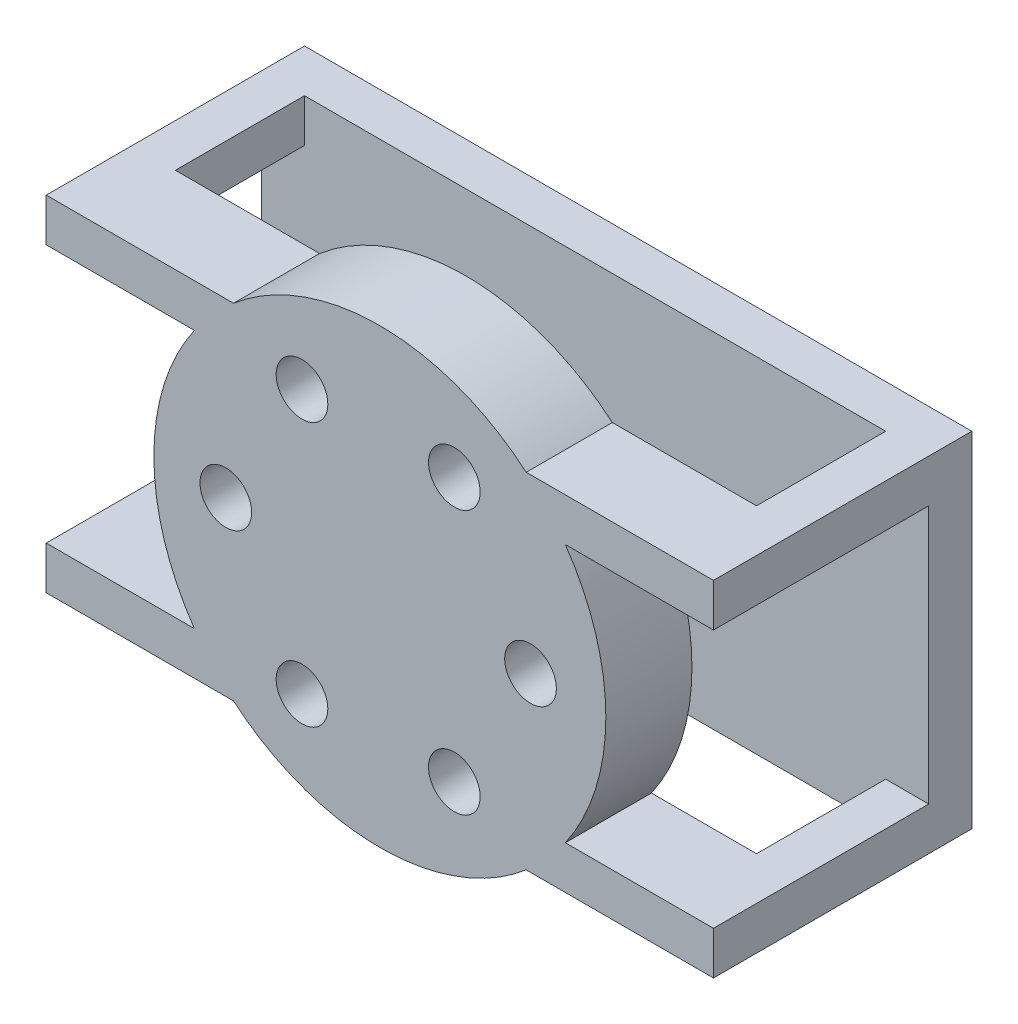
ISO-10303-21;
HEADER;
FILE_DESCRIPTION(('STEP AP214'),'2;1');
FILE_NAME('part.step','',(''),(''),'','','');
FILE_SCHEMA(('AUTOMOTIVE_DESIGN { 1 0 10303 214 1 1 1 1 }'));
ENDSEC;
DATA;
#1=APPLICATION_CONTEXT('core data for automotive mechanical design processes');
#2=APPLICATION_PROTOCOL_DEFINITION('international standard','automotive_design',2000,#1);
#3=PRODUCT_CONTEXT('',#1,'mechanical');
#4=PRODUCT('Part','Part','',(#3));
#5=PRODUCT_RELATED_PRODUCT_CATEGORY('part','',(#4));
#6=PRODUCT_DEFINITION_FORMATION('','',#4);
#7=PRODUCT_DEFINITION_CONTEXT('part definition',#1,'design');
#8=PRODUCT_DEFINITION('design','',#6,#7);
#9=PRODUCT_DEFINITION_SHAPE('','',#8);
#10=(LENGTH_UNIT() NAMED_UNIT(*) SI_UNIT(.MILLI.,.METRE.));
#11=(NAMED_UNIT(*) PLANE_ANGLE_UNIT() SI_UNIT($,.RADIAN.));
#12=(NAMED_UNIT(*) SI_UNIT($,.STERADIAN.) SOLID_ANGLE_UNIT());
#13=UNCERTAINTY_MEASURE_WITH_UNIT(LENGTH_MEASURE(1.E-05),#10,'distance_accuracy_value','');
#14=(GEOMETRIC_REPRESENTATION_CONTEXT(3) GLOBAL_UNCERTAINTY_ASSIGNED_CONTEXT((#13)) GLOBAL_UNIT_ASSIGNED_CONTEXT((#10,
#11,#12)) REPRESENTATION_CONTEXT('',''));
#15=CARTESIAN_POINT('',(0.,0.,0.));
#16=DIRECTION('',(0.,0.,1.));
#17=DIRECTION('',(1.,0.,0.));
#18=AXIS2_PLACEMENT_3D('',#15,#16,#17);
#19=CARTESIAN_POINT('',(-77.5,-30.,0.));
#20=DIRECTION('',(0.,1.,0.));
#21=DIRECTION('',(0.,0.,1.));
#22=AXIS2_PLACEMENT_3D('',#19,#20,#21);
#23=PLANE('',#22);
#24=DIRECTION('',(0.,0.,1.));
#25=VECTOR('',#24,1.);
#26=CARTESIAN_POINT('',(-67.5,-30.,0.));
#27=LINE('',#26,#25);
#28=CARTESIAN_POINT('',(-67.5,-30.,-50.));
#29=VERTEX_POINT('',#28);
#30=CARTESIAN_POINT('',(-67.5,-30.,-20.));
#31=VERTEX_POINT('',#30);
#32=EDGE_CURVE('E274',#29,#31,#27,.T.);
#33=ORIENTED_EDGE('',*,*,#32,.F.);
#34=DIRECTION('',(1.,0.,0.));
#35=VECTOR('',#34,1.);
#36=CARTESIAN_POINT('',(-77.5,-30.,-50.));
#37=LINE('',#36,#35);
#38=CARTESIAN_POINT('',(-77.5,-30.,-50.));
#39=VERTEX_POINT('',#38);
#40=EDGE_CURVE('E396',#39,#29,#37,.T.);
#41=ORIENTED_EDGE('',*,*,#40,.F.);
#42=DIRECTION('',(0.,0.,1.));
#43=VECTOR('',#42,1.);
#44=CARTESIAN_POINT('',(-77.5,-30.,0.));
#45=LINE('',#44,#43);
#46=CARTESIAN_POINT('',(-77.5,-30.,0.));
#47=VERTEX_POINT('',#46);
#48=EDGE_CURVE('E357',#39,#47,#45,.T.);
#49=ORIENTED_EDGE('',*,*,#48,.T.);
#50=DIRECTION('',(1.,0.,0.));
#51=VECTOR('',#50,1.);
#52=CARTESIAN_POINT('',(-77.5,-30.,0.));
#53=LINE('',#52,#51);
#54=CARTESIAN_POINT('',(-43.0842198490352,-30.,0.));
#55=VERTEX_POINT('',#54);
#56=EDGE_CURVE('E392',#47,#55,#53,.T.);
#57=ORIENTED_EDGE('',*,*,#56,.T.);
#58=DIRECTION('',(0.,0.,1.));
#59=VECTOR('',#58,1.);
#60=CARTESIAN_POINT('',(-43.0842198490352,-30.,-20.));
#61=LINE('',#60,#59);
#62=CARTESIAN_POINT('',(-43.0842198490352,-30.,-20.));
#63=VERTEX_POINT('',#62);
#64=EDGE_CURVE('E295',#63,#55,#61,.T.);
#65=ORIENTED_EDGE('',*,*,#64,.F.);
#66=DIRECTION('',(1.,0.,0.));
#67=VECTOR('',#66,1.);
#68=CARTESIAN_POINT('',(-77.5,-30.,-20.));
#69=LINE('',#68,#67);
#70=EDGE_CURVE('E262',#31,#63,#69,.T.);
#71=ORIENTED_EDGE('',*,*,#70,.F.);
#72=EDGE_LOOP('',(#33,#41,#49,#57,#65,#71));
#73=FACE_BOUND('',#72,.T.);
#74=ADVANCED_FACE('F45',(#73),#23,.T.);
#75=CARTESIAN_POINT('',(-77.5,30.,-50.));
#76=DIRECTION('',(0.,-1.,0.));
#77=DIRECTION('',(0.,0.,-1.));
#78=AXIS2_PLACEMENT_3D('',#75,#76,#77);
#79=PLANE('',#78);
#80=DIRECTION('',(0.,0.,1.));
#81=VECTOR('',#80,1.);
#82=CARTESIAN_POINT('',(67.5,30.,-50.));
#83=LINE('',#82,#81);
#84=CARTESIAN_POINT('',(67.5,30.,-50.));
#85=VERTEX_POINT('',#84);
#86=CARTESIAN_POINT('',(67.5,30.,-20.));
#87=VERTEX_POINT('',#86);
#88=EDGE_CURVE('E11',#85,#87,#83,.T.);
#89=ORIENTED_EDGE('',*,*,#88,.F.);
#90=DIRECTION('',(1.,0.,0.));
#91=VECTOR('',#90,1.);
#92=CARTESIAN_POINT('',(-77.5,30.,-50.));
#93=LINE('',#92,#91);
#94=CARTESIAN_POINT('',(77.5,30.,-50.));
#95=VERTEX_POINT('',#94);
#96=EDGE_CURVE('E405',#85,#95,#93,.T.);
#97=ORIENTED_EDGE('',*,*,#96,.T.);
#98=DIRECTION('',(0.,0.,-1.));
#99=VECTOR('',#98,1.);
#100=CARTESIAN_POINT('',(77.5,30.,-50.));
#101=LINE('',#100,#99);
#102=CARTESIAN_POINT('',(77.5,30.,0.));
#103=VERTEX_POINT('',#102);
#104=EDGE_CURVE('E317',#103,#95,#101,.T.);
#105=ORIENTED_EDGE('',*,*,#104,.F.);
#106=DIRECTION('',(1.,0.,0.));
#107=VECTOR('',#106,1.);
#108=CARTESIAN_POINT('',(-77.5,30.,0.));
#109=LINE('',#108,#107);
#110=CARTESIAN_POINT('',(43.0842198490352,30.,0.));
#111=VERTEX_POINT('',#110);
#112=EDGE_CURVE('E376',#111,#103,#109,.T.);
#113=ORIENTED_EDGE('',*,*,#112,.F.);
#114=DIRECTION('',(0.,0.,1.));
#115=VECTOR('',#114,1.);
#116=CARTESIAN_POINT('',(43.0842198490352,30.,-20.));
#117=LINE('',#116,#115);
#118=CARTESIAN_POINT('',(43.0842198490352,30.,-20.));
#119=VERTEX_POINT('',#118);
#120=EDGE_CURVE('E413',#119,#111,#117,.T.);
#121=ORIENTED_EDGE('',*,*,#120,.F.);
#122=DIRECTION('',(-1.,0.,0.));
#123=VECTOR('',#122,1.);
#124=CARTESIAN_POINT('',(-77.5,30.,-20.));
#125=LINE('',#124,#123);
#126=EDGE_CURVE('E259',#87,#119,#125,.T.);
#127=ORIENTED_EDGE('',*,*,#126,.F.);
#128=EDGE_LOOP('',(#89,#97,#105,#113,#121,#127));
#129=FACE_BOUND('',#128,.T.);
#130=ADVANCED_FACE('F501',(#129),#79,.T.);
#131=CARTESIAN_POINT('',(-77.5,40.,0.));
#132=DIRECTION('',(0.,1.,0.));
#133=DIRECTION('',(0.,0.,1.));
#134=AXIS2_PLACEMENT_3D('',#131,#132,#133);
#135=PLANE('',#134);
#136=DIRECTION('',(1.,0.,0.));
#137=VECTOR('',#136,1.);
#138=CARTESIAN_POINT('',(-67.5,40.,-20.));
#139=LINE('',#138,#137);
#140=CARTESIAN_POINT('',(-67.5,40.,-20.));
#141=VERTEX_POINT('',#140);
#142=CARTESIAN_POINT('',(-34.0036762718386,40.,-20.));
#143=VERTEX_POINT('',#142);
#144=EDGE_CURVE('E61',#141,#143,#139,.T.);
#145=ORIENTED_EDGE('',*,*,#144,.F.);
#146=DIRECTION('',(0.,0.,1.));
#147=VECTOR('',#146,1.);
#148=CARTESIAN_POINT('',(-67.5,40.,-50.));
#149=LINE('',#148,#147);
#150=CARTESIAN_POINT('',(-67.5,40.,-50.));
#151=VERTEX_POINT('',#150);
#152=EDGE_CURVE('E218',#151,#141,#149,.T.);
#153=ORIENTED_EDGE('',*,*,#152,.F.);
#154=DIRECTION('',(-1.,0.,0.));
#155=VECTOR('',#154,1.);
#156=CARTESIAN_POINT('',(-67.5,40.,-50.));
#157=LINE('',#156,#155);
#158=CARTESIAN_POINT('',(67.5,40.,-50.));
#159=VERTEX_POINT('',#158);
#160=EDGE_CURVE('E215',#159,#151,#157,.T.);
#161=ORIENTED_EDGE('',*,*,#160,.F.);
#162=DIRECTION('',(0.,0.,-1.));
#163=VECTOR('',#162,1.);
#164=CARTESIAN_POINT('',(67.5,40.,-50.));
#165=LINE('',#164,#163);
#166=CARTESIAN_POINT('',(67.5,40.,-20.));
#167=VERTEX_POINT('',#166);
#168=EDGE_CURVE('E232',#167,#159,#165,.T.);
#169=ORIENTED_EDGE('',*,*,#168,.F.);
#170=CARTESIAN_POINT('',(34.0036762718386,40.,-20.));
#171=VERTEX_POINT('',#170);
#172=EDGE_CURVE('E225',#171,#167,#139,.T.);
#173=ORIENTED_EDGE('',*,*,#172,.F.);
#174=DIRECTION('',(0.,0.,1.));
#175=VECTOR('',#174,1.);
#176=CARTESIAN_POINT('',(34.0036762718386,40.,-20.));
#177=LINE('',#176,#175);
#178=CARTESIAN_POINT('',(34.0036762718386,40.,0.));
#179=VERTEX_POINT('',#178);
#180=EDGE_CURVE('E307',#179,#171,#177,.F.);
#181=ORIENTED_EDGE('',*,*,#180,.F.);
#182=DIRECTION('',(1.,0.,0.));
#183=VECTOR('',#182,1.);
#184=CARTESIAN_POINT('',(-77.5,40.,0.));
#185=LINE('',#184,#183);
#186=CARTESIAN_POINT('',(77.5,40.,0.));
#187=VERTEX_POINT('',#186);
#188=EDGE_CURVE('E380',#179,#187,#185,.T.);
#189=ORIENTED_EDGE('',*,*,#188,.T.);
#190=DIRECTION('',(0.,0.,1.));
#191=VECTOR('',#190,1.);
#192=CARTESIAN_POINT('',(77.5,40.,0.));
#193=LINE('',#192,#191);
#194=CARTESIAN_POINT('',(77.5,40.,-60.));
#195=VERTEX_POINT('',#194);
#196=EDGE_CURVE('E341',#195,#187,#193,.T.);
#197=ORIENTED_EDGE('',*,*,#196,.F.);
#198=DIRECTION('',(1.,0.,0.));
#199=VECTOR('',#198,1.);
#200=CARTESIAN_POINT('',(-77.5,40.,-60.));
#201=LINE('',#200,#199);
#202=CARTESIAN_POINT('',(-77.5,40.,-60.));
#203=VERTEX_POINT('',#202);
#204=EDGE_CURVE('E381',#203,#195,#201,.T.);
#205=ORIENTED_EDGE('',*,*,#204,.F.);
#206=DIRECTION('',(0.,0.,1.));
#207=VECTOR('',#206,1.);
#208=CARTESIAN_POINT('',(-77.5,40.,0.));
#209=LINE('',#208,#207);
#210=CARTESIAN_POINT('',(-77.5,40.,0.));
#211=VERTEX_POINT('',#210);
#212=EDGE_CURVE('E373',#203,#211,#209,.T.);
#213=ORIENTED_EDGE('',*,*,#212,.T.);
#214=CARTESIAN_POINT('',(-34.0036762718386,40.,0.));
#215=VERTEX_POINT('',#214);
#216=EDGE_CURVE('E68',#211,#215,#185,.T.);
#217=ORIENTED_EDGE('',*,*,#216,.T.);
#218=DIRECTION('',(0.,0.,1.));
#219=VECTOR('',#218,1.);
#220=CARTESIAN_POINT('',(-34.0036762718386,40.,-20.));
#221=LINE('',#220,#219);
#222=EDGE_CURVE('E229',#143,#215,#221,.T.);
#223=ORIENTED_EDGE('',*,*,#222,.F.);
#224=EDGE_LOOP('',(#145,#153,#161,#169,#173,#181,#189,#197,#205,#213,#217,#223));
#225=FACE_BOUND('',#224,.T.);
#226=ADVANCED_FACE('F228',(#225),#135,.T.);
#227=CARTESIAN_POINT('',(-77.5,40.,-60.));
#228=DIRECTION('',(0.,0.,-1.));
#229=DIRECTION('',(-1.,0.,0.));
#230=AXIS2_PLACEMENT_3D('',#227,#228,#229);
#231=PLANE('',#230);
#232=ORIENTED_EDGE('',*,*,#204,.T.);
#233=DIRECTION('',(0.,1.,0.));
#234=VECTOR('',#233,1.);
#235=CARTESIAN_POINT('',(77.5,40.,-60.));
#236=LINE('',#235,#234);
#237=CARTESIAN_POINT('',(77.5,-40.,-60.));
#238=VERTEX_POINT('',#237);
#239=EDGE_CURVE('E337',#238,#195,#236,.T.);
#240=ORIENTED_EDGE('',*,*,#239,.F.);
#241=DIRECTION('',(1.,0.,0.));
#242=VECTOR('',#241,1.);
#243=CARTESIAN_POINT('',(-77.5,-40.,-60.));
#244=LINE('',#243,#242);
#245=CARTESIAN_POINT('',(-77.5,-40.,-60.));
#246=VERTEX_POINT('',#245);
#247=EDGE_CURVE('E384',#246,#238,#244,.T.);
#248=ORIENTED_EDGE('',*,*,#247,.F.);
#249=DIRECTION('',(0.,1.,0.));
#250=VECTOR('',#249,1.);
#251=CARTESIAN_POINT('',(-77.5,40.,-60.));
#252=LINE('',#251,#250);
#253=EDGE_CURVE('E369',#246,#203,#252,.T.);
#254=ORIENTED_EDGE('',*,*,#253,.T.);
#255=EDGE_LOOP('',(#232,#240,#248,#254));
#256=FACE_BOUND('',#255,.T.);
#257=ADVANCED_FACE('F540',(#256),#231,.T.);
#258=CARTESIAN_POINT('',(-77.5,-40.,-60.));
#259=DIRECTION('',(0.,-1.,0.));
#260=DIRECTION('',(0.,0.,-1.));
#261=AXIS2_PLACEMENT_3D('',#258,#259,#260);
#262=PLANE('',#261);
#263=DIRECTION('',(-1.,0.,0.));
#264=VECTOR('',#263,1.);
#265=CARTESIAN_POINT('',(-77.5,-40.,-20.));
#266=LINE('',#265,#264);
#267=CARTESIAN_POINT('',(67.5,-40.,-20.));
#268=VERTEX_POINT('',#267);
#269=CARTESIAN_POINT('',(34.0036762718386,-40.,-20.));
#270=VERTEX_POINT('',#269);
#271=EDGE_CURVE('E258',#268,#270,#266,.T.);
#272=ORIENTED_EDGE('',*,*,#271,.F.);
#273=DIRECTION('',(0.,0.,1.));
#274=VECTOR('',#273,1.);
#275=CARTESIAN_POINT('',(67.5,-40.,-60.));
#276=LINE('',#275,#274);
#277=CARTESIAN_POINT('',(67.5,-40.,-50.));
#278=VERTEX_POINT('',#277);
#279=EDGE_CURVE('E268',#278,#268,#276,.T.);
#280=ORIENTED_EDGE('',*,*,#279,.F.);
#281=DIRECTION('',(1.,0.,0.));
#282=VECTOR('',#281,1.);
#283=CARTESIAN_POINT('',(-77.5,-40.,-50.));
#284=LINE('',#283,#282);
#285=CARTESIAN_POINT('',(-67.5,-40.,-50.));
#286=VERTEX_POINT('',#285);
#287=EDGE_CURVE('E271',#286,#278,#284,.T.);
#288=ORIENTED_EDGE('',*,*,#287,.F.);
#289=DIRECTION('',(0.,0.,-1.));
#290=VECTOR('',#289,1.);
#291=CARTESIAN_POINT('',(-67.5,-40.,-60.));
#292=LINE('',#291,#290);
#293=CARTESIAN_POINT('',(-67.5,-40.,-20.));
#294=VERTEX_POINT('',#293);
#295=EDGE_CURVE('E277',#294,#286,#292,.T.);
#296=ORIENTED_EDGE('',*,*,#295,.F.);
#297=CARTESIAN_POINT('',(-34.0036762718386,-40.,-20.));
#298=VERTEX_POINT('',#297);
#299=EDGE_CURVE('E254',#298,#294,#266,.T.);
#300=ORIENTED_EDGE('',*,*,#299,.F.);
#301=DIRECTION('',(0.,0.,1.));
#302=VECTOR('',#301,1.);
#303=CARTESIAN_POINT('',(-34.0036762718386,-40.,-20.));
#304=LINE('',#303,#302);
#305=CARTESIAN_POINT('',(-34.0036762718386,-40.,0.));
#306=VERTEX_POINT('',#305);
#307=EDGE_CURVE('E299',#306,#298,#304,.F.);
#308=ORIENTED_EDGE('',*,*,#307,.F.);
#309=DIRECTION('',(1.,0.,0.));
#310=VECTOR('',#309,1.);
#311=CARTESIAN_POINT('',(-77.5,-40.,0.));
#312=LINE('',#311,#310);
#313=CARTESIAN_POINT('',(-77.5,-40.,0.));
#314=VERTEX_POINT('',#313);
#315=EDGE_CURVE('E387',#314,#306,#312,.T.);
#316=ORIENTED_EDGE('',*,*,#315,.F.);
#317=DIRECTION('',(0.,0.,-1.));
#318=VECTOR('',#317,1.);
#319=CARTESIAN_POINT('',(-77.5,-40.,-60.));
#320=LINE('',#319,#318);
#321=EDGE_CURVE('E365',#314,#246,#320,.T.);
#322=ORIENTED_EDGE('',*,*,#321,.T.);
#323=ORIENTED_EDGE('',*,*,#247,.T.);
#324=DIRECTION('',(0.,0.,-1.));
#325=VECTOR('',#324,1.);
#326=CARTESIAN_POINT('',(77.5,-40.,-60.));
#327=LINE('',#326,#325);
#328=CARTESIAN_POINT('',(77.5,-40.,0.));
#329=VERTEX_POINT('',#328);
#330=EDGE_CURVE('E333',#329,#238,#327,.T.);
#331=ORIENTED_EDGE('',*,*,#330,.F.);
#332=CARTESIAN_POINT('',(34.0036762718386,-40.,0.));
#333=VERTEX_POINT('',#332);
#334=EDGE_CURVE('E391',#333,#329,#312,.T.);
#335=ORIENTED_EDGE('',*,*,#334,.F.);
#336=DIRECTION('',(0.,0.,1.));
#337=VECTOR('',#336,1.);
#338=CARTESIAN_POINT('',(34.0036762718386,-40.,-20.));
#339=LINE('',#338,#337);
#340=EDGE_CURVE('E303',#270,#333,#339,.T.);
#341=ORIENTED_EDGE('',*,*,#340,.F.);
#342=EDGE_LOOP('',(#272,#280,#288,#296,#300,#308,#316,#322,#323,#331,#335,#341));
#343=FACE_BOUND('',#342,.T.);
#344=ADVANCED_FACE('F451',(#343),#262,.T.);
#345=CARTESIAN_POINT('',(-77.5,-40.,0.));
#346=DIRECTION('',(0.,0.,1.));
#347=DIRECTION('',(1.,0.,0.));
#348=AXIS2_PLACEMENT_3D('',#345,#346,#347);
#349=PLANE('',#348);
#350=CARTESIAN_POINT('',(17.3038145922156,-30.650692226442,0.));
#351=DIRECTION('',(0.,0.,1.));
#352=DIRECTION('',(1.,0.,0.));
#353=AXIS2_PLACEMENT_3D('',#350,#351,#352);
#354=CIRCLE('',#353,6.00000000000001);
#355=CARTESIAN_POINT('',(23.3038145922156,-30.650692226442,0.));
#356=VERTEX_POINT('',#355);
#357=EDGE_CURVE('E781',#356,#356,#354,.T.);
#358=ORIENTED_EDGE('',*,*,#357,.F.);
#359=EDGE_LOOP('',(#358));
#360=FACE_BOUND('',#359,.T.);
#361=CARTESIAN_POINT('',(-18.0885562233539,-30.6506922264423,0.));
#362=DIRECTION('',(0.,0.,1.));
#363=DIRECTION('',(1.,0.,0.));
#364=AXIS2_PLACEMENT_3D('',#361,#362,#363);
#365=CIRCLE('',#364,6.00000000000001);
#366=CARTESIAN_POINT('',(-12.0885562233539,-30.6506922264423,0.));
#367=VERTEX_POINT('',#366);
#368=EDGE_CURVE('E775',#367,#367,#365,.T.);
#369=ORIENTED_EDGE('',*,*,#368,.F.);
#370=EDGE_LOOP('',(#369));
#371=FACE_BOUND('',#370,.T.);
#372=CARTESIAN_POINT('',(-35.784741631139,0.,0.));
#373=DIRECTION('',(0.,0.,1.));
#374=DIRECTION('',(1.,0.,0.));
#375=AXIS2_PLACEMENT_3D('',#372,#373,#374);
#376=CIRCLE('',#375,6.00000000000001);
#377=CARTESIAN_POINT('',(-29.784741631139,0.,0.));
#378=VERTEX_POINT('',#377);
#379=EDGE_CURVE('E769',#378,#378,#376,.T.);
#380=ORIENTED_EDGE('',*,*,#379,.F.);
#381=EDGE_LOOP('',(#380));
#382=FACE_BOUND('',#381,.T.);
#383=CARTESIAN_POINT('',(-18.0885562233544,30.6506922264421,0.));
#384=DIRECTION('',(0.,0.,1.));
#385=DIRECTION('',(1.,0.,0.));
#386=AXIS2_PLACEMENT_3D('',#383,#384,#385);
#387=CIRCLE('',#386,6.00000000000001);
#388=CARTESIAN_POINT('',(-12.0885562233544,30.6506922264421,0.));
#389=VERTEX_POINT('',#388);
#390=EDGE_CURVE('E763',#389,#389,#387,.T.);
#391=ORIENTED_EDGE('',*,*,#390,.F.);
#392=EDGE_LOOP('',(#391));
#393=FACE_BOUND('',#392,.T.);
#394=CARTESIAN_POINT('',(17.3038145922152,30.6506922264422,0.));
#395=DIRECTION('',(0.,0.,1.));
#396=DIRECTION('',(1.,0.,0.));
#397=AXIS2_PLACEMENT_3D('',#394,#395,#396);
#398=CIRCLE('',#397,6.00000000000001);
#399=CARTESIAN_POINT('',(23.3038145922152,30.6506922264422,0.));
#400=VERTEX_POINT('',#399);
#401=EDGE_CURVE('E757',#400,#400,#398,.T.);
#402=ORIENTED_EDGE('',*,*,#401,.F.);
#403=EDGE_LOOP('',(#402));
#404=FACE_BOUND('',#403,.T.);
#405=CARTESIAN_POINT('',(35.,0.,0.));
#406=DIRECTION('',(0.,0.,1.));
#407=DIRECTION('',(1.,0.,0.));
#408=AXIS2_PLACEMENT_3D('',#405,#406,#407);
#409=CIRCLE('',#408,6.00000000000001);
#410=CARTESIAN_POINT('',(41.,0.,0.));
#411=VERTEX_POINT('',#410);
#412=EDGE_CURVE('E750',#411,#411,#409,.T.);
#413=ORIENTED_EDGE('',*,*,#412,.F.);
#414=EDGE_LOOP('',(#413));
#415=FACE_BOUND('',#414,.T.);
#416=CARTESIAN_POINT('',(43.0842198490352,-30.,0.));
#417=VERTEX_POINT('',#416);
#418=CARTESIAN_POINT('',(77.5,-30.,0.));
#419=VERTEX_POINT('',#418);
#420=EDGE_CURVE('E395',#417,#419,#53,.T.);
#421=ORIENTED_EDGE('',*,*,#420,.F.);
#422=CARTESIAN_POINT('',(0.,0.,0.));
#423=DIRECTION('',(0.,0.,1.));
#424=DIRECTION('',(1.,0.,0.));
#425=AXIS2_PLACEMENT_3D('',#422,#423,#424);
#426=CIRCLE('',#425,52.5);
#427=EDGE_CURVE('E280',#417,#111,#426,.T.);
#428=ORIENTED_EDGE('',*,*,#427,.T.);
#429=ORIENTED_EDGE('',*,*,#112,.T.);
#430=DIRECTION('',(0.,-1.,0.));
#431=VECTOR('',#430,1.);
#432=CARTESIAN_POINT('',(77.5,30.,0.));
#433=LINE('',#432,#431);
#434=EDGE_CURVE('E313',#187,#103,#433,.T.);
#435=ORIENTED_EDGE('',*,*,#434,.F.);
#436=ORIENTED_EDGE('',*,*,#188,.F.);
#437=EDGE_CURVE('E286',#179,#215,#426,.T.);
#438=ORIENTED_EDGE('',*,*,#437,.T.);
#439=ORIENTED_EDGE('',*,*,#216,.F.);
#440=DIRECTION('',(0.,-1.,0.));
#441=VECTOR('',#440,1.);
#442=CARTESIAN_POINT('',(-77.5,30.,0.));
#443=LINE('',#442,#441);
#444=CARTESIAN_POINT('',(-77.5,30.,0.));
#445=VERTEX_POINT('',#444);
#446=EDGE_CURVE('E345',#211,#445,#443,.T.);
#447=ORIENTED_EDGE('',*,*,#446,.T.);
#448=CARTESIAN_POINT('',(-43.0842198490352,30.,0.));
#449=VERTEX_POINT('',#448);
#450=EDGE_CURVE('E406',#445,#449,#109,.T.);
#451=ORIENTED_EDGE('',*,*,#450,.T.);
#452=EDGE_CURVE('E438',#449,#55,#426,.T.);
#453=ORIENTED_EDGE('',*,*,#452,.T.);
#454=ORIENTED_EDGE('',*,*,#56,.F.);
#455=DIRECTION('',(0.,-1.,0.));
#456=VECTOR('',#455,1.);
#457=CARTESIAN_POINT('',(-77.5,-40.,0.));
#458=LINE('',#457,#456);
#459=EDGE_CURVE('E361',#47,#314,#458,.T.);
#460=ORIENTED_EDGE('',*,*,#459,.T.);
#461=ORIENTED_EDGE('',*,*,#315,.T.);
#462=EDGE_CURVE('E290',#306,#333,#426,.T.);
#463=ORIENTED_EDGE('',*,*,#462,.T.);
#464=ORIENTED_EDGE('',*,*,#334,.T.);
#465=DIRECTION('',(0.,-1.,0.));
#466=VECTOR('',#465,1.);
#467=CARTESIAN_POINT('',(77.5,-40.,0.));
#468=LINE('',#467,#466);
#469=EDGE_CURVE('E329',#419,#329,#468,.T.);
#470=ORIENTED_EDGE('',*,*,#469,.F.);
#471=EDGE_LOOP('',(#421,#428,#429,#435,#436,#438,#439,#447,#451,#453,#454,#460,#461,#463,#464,#470));
#472=FACE_BOUND('',#471,.T.);
#473=ADVANCED_FACE('F430',(#360,#371,#382,#393,#404,#415,#472),#349,.T.);
#474=DIRECTION('',(0.,0.,-1.));
#475=VECTOR('',#474,1.);
#476=CARTESIAN_POINT('',(67.5,-30.,0.));
#477=LINE('',#476,#475);
#478=CARTESIAN_POINT('',(67.5,-30.,-20.));
#479=VERTEX_POINT('',#478);
#480=CARTESIAN_POINT('',(67.5,-30.,-50.));
#481=VERTEX_POINT('',#480);
#482=EDGE_CURVE('E265',#479,#481,#477,.T.);
#483=ORIENTED_EDGE('',*,*,#482,.F.);
#484=CARTESIAN_POINT('',(43.0842198490352,-30.,-20.));
#485=VERTEX_POINT('',#484);
#486=EDGE_CURVE('E257',#485,#479,#69,.T.);
#487=ORIENTED_EDGE('',*,*,#486,.F.);
#488=DIRECTION('',(0.,0.,1.));
#489=VECTOR('',#488,1.);
#490=CARTESIAN_POINT('',(43.0842198490352,-30.,-20.));
#491=LINE('',#490,#489);
#492=EDGE_CURVE('E291',#417,#485,#491,.F.);
#493=ORIENTED_EDGE('',*,*,#492,.F.);
#494=ORIENTED_EDGE('',*,*,#420,.T.);
#495=DIRECTION('',(0.,0.,1.));
#496=VECTOR('',#495,1.);
#497=CARTESIAN_POINT('',(77.5,-30.,0.));
#498=LINE('',#497,#496);
#499=CARTESIAN_POINT('',(77.5,-30.,-50.));
#500=VERTEX_POINT('',#499);
#501=EDGE_CURVE('E325',#500,#419,#498,.T.);
#502=ORIENTED_EDGE('',*,*,#501,.F.);
#503=EDGE_CURVE('E400',#481,#500,#37,.T.);
#504=ORIENTED_EDGE('',*,*,#503,.F.);
#505=EDGE_LOOP('',(#483,#487,#493,#494,#502,#504));
#506=FACE_BOUND('',#505,.T.);
#507=ADVANCED_FACE('F491',(#506),#23,.T.);
#508=CARTESIAN_POINT('',(-77.5,-30.,-50.));
#509=DIRECTION('',(0.,0.,1.));
#510=DIRECTION('',(1.,0.,0.));
#511=AXIS2_PLACEMENT_3D('',#508,#509,#510);
#512=PLANE('',#511);
#513=ORIENTED_EDGE('',*,*,#96,.F.);
#514=DIRECTION('',(0.,1.,0.));
#515=VECTOR('',#514,1.);
#516=CARTESIAN_POINT('',(67.5,-52.5,-50.));
#517=LINE('',#516,#515);
#518=EDGE_CURVE('E247',#85,#159,#517,.T.);
#519=ORIENTED_EDGE('',*,*,#518,.T.);
#520=ORIENTED_EDGE('',*,*,#160,.T.);
#521=DIRECTION('',(0.,1.,0.));
#522=VECTOR('',#521,1.);
#523=CARTESIAN_POINT('',(-67.5,-52.5,-50.));
#524=LINE('',#523,#522);
#525=CARTESIAN_POINT('',(-67.5,30.,-50.));
#526=VERTEX_POINT('',#525);
#527=EDGE_CURVE('E221',#526,#151,#524,.T.);
#528=ORIENTED_EDGE('',*,*,#527,.F.);
#529=CARTESIAN_POINT('',(-77.5,30.,-50.));
#530=VERTEX_POINT('',#529);
#531=EDGE_CURVE('E401',#530,#526,#93,.T.);
#532=ORIENTED_EDGE('',*,*,#531,.F.);
#533=DIRECTION('',(0.,-1.,0.));
#534=VECTOR('',#533,1.);
#535=CARTESIAN_POINT('',(-77.5,-30.,-50.));
#536=LINE('',#535,#534);
#537=EDGE_CURVE('E353',#530,#39,#536,.T.);
#538=ORIENTED_EDGE('',*,*,#537,.T.);
#539=ORIENTED_EDGE('',*,*,#40,.T.);
#540=EDGE_CURVE('E245',#286,#29,#524,.T.);
#541=ORIENTED_EDGE('',*,*,#540,.F.);
#542=ORIENTED_EDGE('',*,*,#287,.T.);
#543=EDGE_CURVE('E246',#278,#481,#517,.T.);
#544=ORIENTED_EDGE('',*,*,#543,.T.);
#545=ORIENTED_EDGE('',*,*,#503,.T.);
#546=DIRECTION('',(0.,-1.,0.));
#547=VECTOR('',#546,1.);
#548=CARTESIAN_POINT('',(77.5,-30.,-50.));
#549=LINE('',#548,#547);
#550=EDGE_CURVE('E321',#95,#500,#549,.T.);
#551=ORIENTED_EDGE('',*,*,#550,.F.);
#552=EDGE_LOOP('',(#513,#519,#520,#528,#532,#538,#539,#541,#542,#544,#545,#551));
#553=FACE_BOUND('',#552,.T.);
#554=ADVANCED_FACE('F420',(#553),#512,.T.);
#555=DIRECTION('',(0.,0.,-1.));
#556=VECTOR('',#555,1.);
#557=CARTESIAN_POINT('',(-67.5,30.,-50.));
#558=LINE('',#557,#556);
#559=CARTESIAN_POINT('',(-67.5,30.,-20.));
#560=VERTEX_POINT('',#559);
#561=EDGE_CURVE('E54',#560,#526,#558,.T.);
#562=ORIENTED_EDGE('',*,*,#561,.F.);
#563=CARTESIAN_POINT('',(-43.0842198490352,30.,-20.));
#564=VERTEX_POINT('',#563);
#565=EDGE_CURVE('E210',#564,#560,#125,.T.);
#566=ORIENTED_EDGE('',*,*,#565,.F.);
#567=DIRECTION('',(0.,0.,1.));
#568=VECTOR('',#567,1.);
#569=CARTESIAN_POINT('',(-43.0842198490352,30.,-20.));
#570=LINE('',#569,#568);
#571=EDGE_CURVE('E379',#449,#564,#570,.F.);
#572=ORIENTED_EDGE('',*,*,#571,.F.);
#573=ORIENTED_EDGE('',*,*,#450,.F.);
#574=DIRECTION('',(0.,0.,-1.));
#575=VECTOR('',#574,1.);
#576=CARTESIAN_POINT('',(-77.5,30.,-50.));
#577=LINE('',#576,#575);
#578=EDGE_CURVE('E349',#445,#530,#577,.T.);
#579=ORIENTED_EDGE('',*,*,#578,.T.);
#580=ORIENTED_EDGE('',*,*,#531,.T.);
#581=EDGE_LOOP('',(#562,#566,#572,#573,#579,#580));
#582=FACE_BOUND('',#581,.T.);
#583=ADVANCED_FACE('F47',(#582),#79,.T.);
#584=CARTESIAN_POINT('',(-77.5,0.,0.));
#585=DIRECTION('',(-1.,0.,0.));
#586=DIRECTION('',(0.,0.,1.));
#587=AXIS2_PLACEMENT_3D('',#584,#585,#586);
#588=PLANE('',#587);
#589=ORIENTED_EDGE('',*,*,#446,.F.);
#590=ORIENTED_EDGE('',*,*,#212,.F.);
#591=ORIENTED_EDGE('',*,*,#253,.F.);
#592=ORIENTED_EDGE('',*,*,#321,.F.);
#593=ORIENTED_EDGE('',*,*,#459,.F.);
#594=ORIENTED_EDGE('',*,*,#48,.F.);
#595=ORIENTED_EDGE('',*,*,#537,.F.);
#596=ORIENTED_EDGE('',*,*,#578,.F.);
#597=EDGE_LOOP('',(#589,#590,#591,#592,#593,#594,#595,#596));
#598=FACE_BOUND('',#597,.T.);
#599=ADVANCED_FACE('F426',(#598),#588,.T.);
#600=CARTESIAN_POINT('',(77.5,0.,0.));
#601=DIRECTION('',(-1.,0.,0.));
#602=DIRECTION('',(0.,0.,1.));
#603=AXIS2_PLACEMENT_3D('',#600,#601,#602);
#604=PLANE('',#603);
#605=ORIENTED_EDGE('',*,*,#434,.T.);
#606=ORIENTED_EDGE('',*,*,#104,.T.);
#607=ORIENTED_EDGE('',*,*,#550,.T.);
#608=ORIENTED_EDGE('',*,*,#501,.T.);
#609=ORIENTED_EDGE('',*,*,#469,.T.);
#610=ORIENTED_EDGE('',*,*,#330,.T.);
#611=ORIENTED_EDGE('',*,*,#239,.T.);
#612=ORIENTED_EDGE('',*,*,#196,.T.);
#613=EDGE_LOOP('',(#605,#606,#607,#608,#609,#610,#611,#612));
#614=FACE_BOUND('',#613,.T.);
#615=ADVANCED_FACE('F496',(#614),#604,.F.);
#616=CARTESIAN_POINT('',(0.,0.,-20.));
#617=DIRECTION('',(0.,0.,1.));
#618=DIRECTION('',(1.,0.,0.));
#619=AXIS2_PLACEMENT_3D('',#616,#617,#618);
#620=CYLINDRICAL_SURFACE('',#619,52.5);
#621=CARTESIAN_POINT('',(0.,0.,-20.));
#622=DIRECTION('',(0.,0.,1.));
#623=DIRECTION('',(1.,0.,0.));
#624=AXIS2_PLACEMENT_3D('',#621,#622,#623);
#625=CIRCLE('',#624,52.5);
#626=EDGE_CURVE('E459',#564,#63,#625,.T.);
#627=ORIENTED_EDGE('',*,*,#626,.T.);
#628=ORIENTED_EDGE('',*,*,#64,.T.);
#629=ORIENTED_EDGE('',*,*,#452,.F.);
#630=ORIENTED_EDGE('',*,*,#571,.T.);
#631=EDGE_LOOP('',(#627,#628,#629,#630));
#632=FACE_BOUND('',#631,.T.);
#633=ADVANCED_FACE('F463',(#632),#620,.T.);
#634=ORIENTED_EDGE('',*,*,#427,.F.);
#635=ORIENTED_EDGE('',*,*,#492,.T.);
#636=EDGE_CURVE('E281',#485,#119,#625,.T.);
#637=ORIENTED_EDGE('',*,*,#636,.T.);
#638=ORIENTED_EDGE('',*,*,#120,.T.);
#639=EDGE_LOOP('',(#634,#635,#637,#638));
#640=FACE_BOUND('',#639,.T.);
#641=ADVANCED_FACE('F511',(#640),#620,.T.);
#642=CARTESIAN_POINT('',(0.,0.,-20.));
#643=DIRECTION('',(0.,0.,1.));
#644=DIRECTION('',(1.,0.,0.));
#645=AXIS2_PLACEMENT_3D('',#642,#643,#644);
#646=PLANE('',#645);
#647=CARTESIAN_POINT('',(17.3038145922156,-30.650692226442,-20.));
#648=DIRECTION('',(0.,0.,1.));
#649=DIRECTION('',(1.,0.,0.));
#650=AXIS2_PLACEMENT_3D('',#647,#648,#649);
#651=CIRCLE('',#650,6.00000000000001);
#652=CARTESIAN_POINT('',(23.3038145922156,-30.650692226442,-20.));
#653=VERTEX_POINT('',#652);
#654=EDGE_CURVE('E730',#653,#653,#651,.T.);
#655=ORIENTED_EDGE('',*,*,#654,.T.);
#656=EDGE_LOOP('',(#655));
#657=FACE_BOUND('',#656,.T.);
#658=CARTESIAN_POINT('',(-18.0885562233539,-30.6506922264423,-20.));
#659=DIRECTION('',(0.,0.,1.));
#660=DIRECTION('',(1.,0.,0.));
#661=AXIS2_PLACEMENT_3D('',#658,#659,#660);
#662=CIRCLE('',#661,6.00000000000001);
#663=CARTESIAN_POINT('',(-12.0885562233539,-30.6506922264423,-20.));
#664=VERTEX_POINT('',#663);
#665=EDGE_CURVE('E734',#664,#664,#662,.T.);
#666=ORIENTED_EDGE('',*,*,#665,.T.);
#667=EDGE_LOOP('',(#666));
#668=FACE_BOUND('',#667,.T.);
#669=CARTESIAN_POINT('',(-35.784741631139,0.,-20.));
#670=DIRECTION('',(0.,0.,1.));
#671=DIRECTION('',(1.,0.,0.));
#672=AXIS2_PLACEMENT_3D('',#669,#670,#671);
#673=CIRCLE('',#672,6.00000000000001);
#674=CARTESIAN_POINT('',(-29.784741631139,0.,-20.));
#675=VERTEX_POINT('',#674);
#676=EDGE_CURVE('E738',#675,#675,#673,.T.);
#677=ORIENTED_EDGE('',*,*,#676,.T.);
#678=EDGE_LOOP('',(#677));
#679=FACE_BOUND('',#678,.T.);
#680=CARTESIAN_POINT('',(-18.0885562233544,30.6506922264421,-20.));
#681=DIRECTION('',(0.,0.,1.));
#682=DIRECTION('',(1.,0.,0.));
#683=AXIS2_PLACEMENT_3D('',#680,#681,#682);
#684=CIRCLE('',#683,6.00000000000001);
#685=CARTESIAN_POINT('',(-12.0885562233544,30.6506922264421,-20.));
#686=VERTEX_POINT('',#685);
#687=EDGE_CURVE('E742',#686,#686,#684,.T.);
#688=ORIENTED_EDGE('',*,*,#687,.T.);
#689=EDGE_LOOP('',(#688));
#690=FACE_BOUND('',#689,.T.);
#691=CARTESIAN_POINT('',(17.3038145922152,30.6506922264422,-20.));
#692=DIRECTION('',(0.,0.,1.));
#693=DIRECTION('',(1.,0.,0.));
#694=AXIS2_PLACEMENT_3D('',#691,#692,#693);
#695=CIRCLE('',#694,6.00000000000001);
#696=CARTESIAN_POINT('',(23.3038145922152,30.6506922264422,-20.));
#697=VERTEX_POINT('',#696);
#698=EDGE_CURVE('E746',#697,#697,#695,.T.);
#699=ORIENTED_EDGE('',*,*,#698,.T.);
#700=EDGE_LOOP('',(#699));
#701=FACE_BOUND('',#700,.T.);
#702=CARTESIAN_POINT('',(35.,0.,-20.));
#703=DIRECTION('',(0.,0.,1.));
#704=DIRECTION('',(1.,0.,0.));
#705=AXIS2_PLACEMENT_3D('',#702,#703,#704);
#706=CIRCLE('',#705,6.00000000000001);
#707=CARTESIAN_POINT('',(41.,0.,-20.));
#708=VERTEX_POINT('',#707);
#709=EDGE_CURVE('E226',#708,#708,#706,.T.);
#710=ORIENTED_EDGE('',*,*,#709,.T.);
#711=EDGE_LOOP('',(#710));
#712=FACE_BOUND('',#711,.T.);
#713=EDGE_CURVE('E285',#298,#270,#625,.T.);
#714=ORIENTED_EDGE('',*,*,#713,.F.);
#715=ORIENTED_EDGE('',*,*,#299,.T.);
#716=DIRECTION('',(0.,1.,0.));
#717=VECTOR('',#716,1.);
#718=CARTESIAN_POINT('',(-67.5,-52.5,-20.));
#719=LINE('',#718,#717);
#720=EDGE_CURVE('E214',#294,#31,#719,.T.);
#721=ORIENTED_EDGE('',*,*,#720,.T.);
#722=ORIENTED_EDGE('',*,*,#70,.T.);
#723=ORIENTED_EDGE('',*,*,#626,.F.);
#724=ORIENTED_EDGE('',*,*,#565,.T.);
#725=EDGE_CURVE('E205',#560,#141,#719,.T.);
#726=ORIENTED_EDGE('',*,*,#725,.T.);
#727=ORIENTED_EDGE('',*,*,#144,.T.);
#728=EDGE_CURVE('E287',#171,#143,#625,.T.);
#729=ORIENTED_EDGE('',*,*,#728,.F.);
#730=ORIENTED_EDGE('',*,*,#172,.T.);
#731=DIRECTION('',(0.,1.,0.));
#732=VECTOR('',#731,1.);
#733=CARTESIAN_POINT('',(67.5,-52.5,-20.));
#734=LINE('',#733,#732);
#735=EDGE_CURVE('E251',#87,#167,#734,.T.);
#736=ORIENTED_EDGE('',*,*,#735,.F.);
#737=ORIENTED_EDGE('',*,*,#126,.T.);
#738=ORIENTED_EDGE('',*,*,#636,.F.);
#739=ORIENTED_EDGE('',*,*,#486,.T.);
#740=EDGE_CURVE('E250',#268,#479,#734,.T.);
#741=ORIENTED_EDGE('',*,*,#740,.F.);
#742=ORIENTED_EDGE('',*,*,#271,.T.);
#743=EDGE_LOOP('',(#714,#715,#721,#722,#723,#724,#726,#727,#729,#730,#736,#737,#738,#739,#741,#742));
#744=FACE_BOUND('',#743,.T.);
#745=ADVANCED_FACE('F208',(#657,#668,#679,#690,#701,#712,#744),#646,.F.);
#746=ORIENTED_EDGE('',*,*,#713,.T.);
#747=ORIENTED_EDGE('',*,*,#340,.T.);
#748=ORIENTED_EDGE('',*,*,#462,.F.);
#749=ORIENTED_EDGE('',*,*,#307,.T.);
#750=EDGE_LOOP('',(#746,#747,#748,#749));
#751=FACE_BOUND('',#750,.T.);
#752=ADVANCED_FACE('F446',(#751),#620,.T.);
#753=ORIENTED_EDGE('',*,*,#728,.T.);
#754=ORIENTED_EDGE('',*,*,#222,.T.);
#755=ORIENTED_EDGE('',*,*,#437,.F.);
#756=ORIENTED_EDGE('',*,*,#180,.T.);
#757=EDGE_LOOP('',(#753,#754,#755,#756));
#758=FACE_BOUND('',#757,.T.);
#759=ADVANCED_FACE('F508',(#758),#620,.T.);
#760=CARTESIAN_POINT('',(67.5,-52.5,-50.));
#761=DIRECTION('',(1.,0.,0.));
#762=DIRECTION('',(0.,0.,-1.));
#763=AXIS2_PLACEMENT_3D('',#760,#761,#762);
#764=PLANE('',#763);
#765=ORIENTED_EDGE('',*,*,#88,.T.);
#766=ORIENTED_EDGE('',*,*,#735,.T.);
#767=ORIENTED_EDGE('',*,*,#168,.T.);
#768=ORIENTED_EDGE('',*,*,#518,.F.);
#769=EDGE_LOOP('',(#765,#766,#767,#768));
#770=FACE_BOUND('',#769,.T.);
#771=ADVANCED_FACE('F506',(#770),#764,.F.);
#772=CARTESIAN_POINT('',(-67.5,-52.5,-50.));
#773=DIRECTION('',(-1.,0.,0.));
#774=DIRECTION('',(0.,0.,1.));
#775=AXIS2_PLACEMENT_3D('',#772,#773,#774);
#776=PLANE('',#775);
#777=ORIENTED_EDGE('',*,*,#561,.T.);
#778=ORIENTED_EDGE('',*,*,#527,.T.);
#779=ORIENTED_EDGE('',*,*,#152,.T.);
#780=ORIENTED_EDGE('',*,*,#725,.F.);
#781=EDGE_LOOP('',(#777,#778,#779,#780));
#782=FACE_BOUND('',#781,.T.);
#783=ADVANCED_FACE('F219',(#782),#776,.F.);
#784=ORIENTED_EDGE('',*,*,#295,.T.);
#785=ORIENTED_EDGE('',*,*,#540,.T.);
#786=ORIENTED_EDGE('',*,*,#32,.T.);
#787=ORIENTED_EDGE('',*,*,#720,.F.);
#788=EDGE_LOOP('',(#784,#785,#786,#787));
#789=FACE_BOUND('',#788,.T.);
#790=ADVANCED_FACE('F649',(#789),#776,.F.);
#791=ORIENTED_EDGE('',*,*,#279,.T.);
#792=ORIENTED_EDGE('',*,*,#740,.T.);
#793=ORIENTED_EDGE('',*,*,#482,.T.);
#794=ORIENTED_EDGE('',*,*,#543,.F.);
#795=EDGE_LOOP('',(#791,#792,#793,#794));
#796=FACE_BOUND('',#795,.T.);
#797=ADVANCED_FACE('F487',(#796),#764,.F.);
#798=CARTESIAN_POINT('',(35.,0.,0.));
#799=DIRECTION('',(0.,0.,1.));
#800=DIRECTION('',(1.,0.,0.));
#801=AXIS2_PLACEMENT_3D('',#798,#799,#800);
#802=CYLINDRICAL_SURFACE('',#801,6.00000000000001);
#803=ORIENTED_EDGE('',*,*,#709,.F.);
#804=EDGE_LOOP('',(#803));
#805=FACE_BOUND('',#804,.T.);
#806=ORIENTED_EDGE('',*,*,#412,.T.);
#807=EDGE_LOOP('',(#806));
#808=FACE_BOUND('',#807,.T.);
#809=ADVANCED_FACE('F664',(#805,#808),#802,.F.);
#810=CARTESIAN_POINT('',(17.3038145922152,30.6506922264422,0.));
#811=DIRECTION('',(0.,0.,1.));
#812=DIRECTION('',(1.,0.,0.));
#813=AXIS2_PLACEMENT_3D('',#810,#811,#812);
#814=CYLINDRICAL_SURFACE('',#813,6.00000000000001);
#815=ORIENTED_EDGE('',*,*,#698,.F.);
#816=EDGE_LOOP('',(#815));
#817=FACE_BOUND('',#816,.T.);
#818=ORIENTED_EDGE('',*,*,#401,.T.);
#819=EDGE_LOOP('',(#818));
#820=FACE_BOUND('',#819,.T.);
#821=ADVANCED_FACE('F670',(#817,#820),#814,.F.);
#822=CARTESIAN_POINT('',(-18.0885562233544,30.6506922264421,0.));
#823=DIRECTION('',(0.,0.,1.));
#824=DIRECTION('',(1.,0.,0.));
#825=AXIS2_PLACEMENT_3D('',#822,#823,#824);
#826=CYLINDRICAL_SURFACE('',#825,6.00000000000001);
#827=ORIENTED_EDGE('',*,*,#687,.F.);
#828=EDGE_LOOP('',(#827));
#829=FACE_BOUND('',#828,.T.);
#830=ORIENTED_EDGE('',*,*,#390,.T.);
#831=EDGE_LOOP('',(#830));
#832=FACE_BOUND('',#831,.T.);
#833=ADVANCED_FACE('F679',(#829,#832),#826,.F.);
#834=CARTESIAN_POINT('',(-35.784741631139,0.,0.));
#835=DIRECTION('',(0.,0.,1.));
#836=DIRECTION('',(1.,0.,0.));
#837=AXIS2_PLACEMENT_3D('',#834,#835,#836);
#838=CYLINDRICAL_SURFACE('',#837,6.00000000000001);
#839=ORIENTED_EDGE('',*,*,#676,.F.);
#840=EDGE_LOOP('',(#839));
#841=FACE_BOUND('',#840,.T.);
#842=ORIENTED_EDGE('',*,*,#379,.T.);
#843=EDGE_LOOP('',(#842));
#844=FACE_BOUND('',#843,.T.);
#845=ADVANCED_FACE('F688',(#841,#844),#838,.F.);
#846=CARTESIAN_POINT('',(-18.0885562233539,-30.6506922264423,0.));
#847=DIRECTION('',(0.,0.,1.));
#848=DIRECTION('',(1.,0.,0.));
#849=AXIS2_PLACEMENT_3D('',#846,#847,#848);
#850=CYLINDRICAL_SURFACE('',#849,6.00000000000001);
#851=ORIENTED_EDGE('',*,*,#665,.F.);
#852=EDGE_LOOP('',(#851));
#853=FACE_BOUND('',#852,.T.);
#854=ORIENTED_EDGE('',*,*,#368,.T.);
#855=EDGE_LOOP('',(#854));
#856=FACE_BOUND('',#855,.T.);
#857=ADVANCED_FACE('F697',(#853,#856),#850,.F.);
#858=CARTESIAN_POINT('',(17.3038145922156,-30.650692226442,0.));
#859=DIRECTION('',(0.,0.,1.));
#860=DIRECTION('',(1.,0.,0.));
#861=AXIS2_PLACEMENT_3D('',#858,#859,#860);
#862=CYLINDRICAL_SURFACE('',#861,6.00000000000001);
#863=ORIENTED_EDGE('',*,*,#654,.F.);
#864=EDGE_LOOP('',(#863));
#865=FACE_BOUND('',#864,.T.);
#866=ORIENTED_EDGE('',*,*,#357,.T.);
#867=EDGE_LOOP('',(#866));
#868=FACE_BOUND('',#867,.T.);
#869=ADVANCED_FACE('F706',(#865,#868),#862,.F.);
#870=CLOSED_SHELL('',(#74,#130,#226,#257,#344,#473,#507,#554,#583,#599,#615,#633,#641,#745,#752,
#759,#771,#783,#790,#797,#809,#821,#833,#845,#857,#869));
#871=MANIFOLD_SOLID_BREP('B2',#870);
#872=ADVANCED_BREP_SHAPE_REPRESENTATION('',(#18,#871),#14);
#873=SHAPE_DEFINITION_REPRESENTATION(#9,#872);
ENDSEC;
END-ISO-10303-21;
